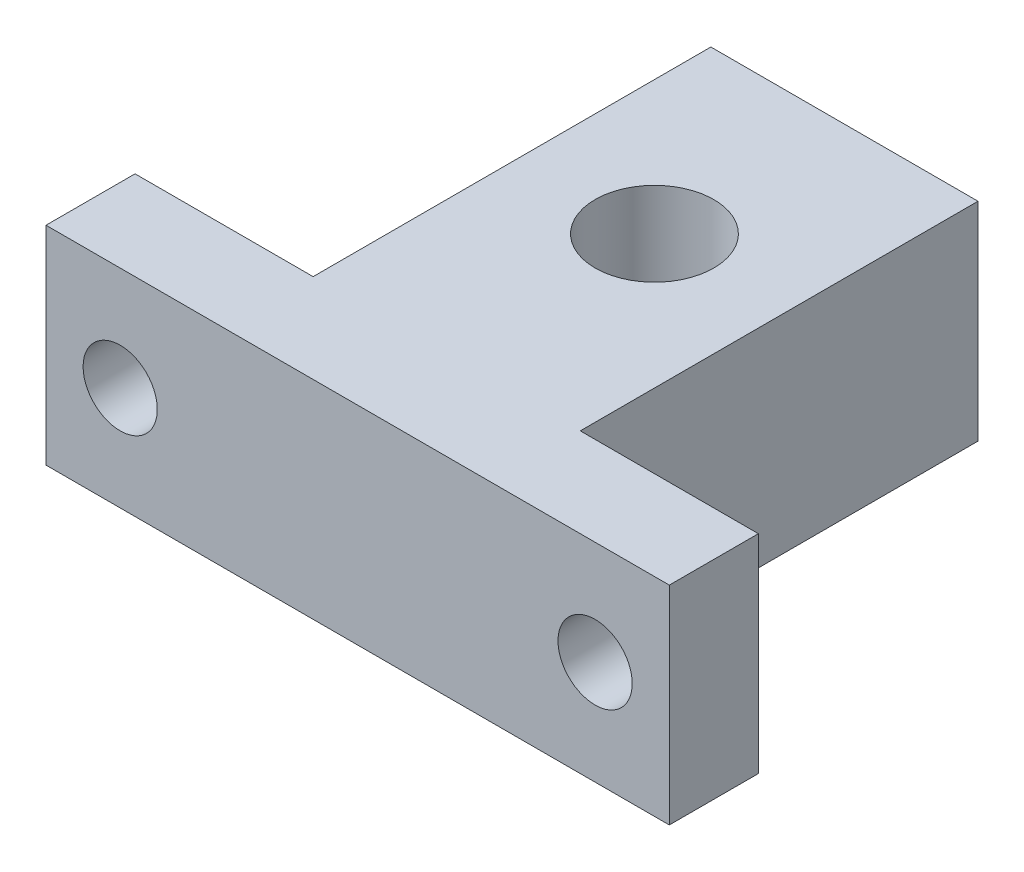
ISO-10303-21;
HEADER;
FILE_DESCRIPTION(('STEP AP214'),'2;1');
FILE_NAME('part.step','',(''),(''),'','','');
FILE_SCHEMA(('AUTOMOTIVE_DESIGN { 1 0 10303 214 1 1 1 1 }'));
ENDSEC;
DATA;
#1=APPLICATION_CONTEXT('core data for automotive mechanical design processes');
#2=APPLICATION_PROTOCOL_DEFINITION('international standard','automotive_design',2000,#1);
#3=PRODUCT_CONTEXT('',#1,'mechanical');
#4=PRODUCT('Part','Part','',(#3));
#5=PRODUCT_RELATED_PRODUCT_CATEGORY('part','',(#4));
#6=PRODUCT_DEFINITION_FORMATION('','',#4);
#7=PRODUCT_DEFINITION_CONTEXT('part definition',#1,'design');
#8=PRODUCT_DEFINITION('design','',#6,#7);
#9=PRODUCT_DEFINITION_SHAPE('','',#8);
#10=(LENGTH_UNIT() NAMED_UNIT(*) SI_UNIT(.MILLI.,.METRE.));
#11=(NAMED_UNIT(*) PLANE_ANGLE_UNIT() SI_UNIT($,.RADIAN.));
#12=(NAMED_UNIT(*) SI_UNIT($,.STERADIAN.) SOLID_ANGLE_UNIT());
#13=UNCERTAINTY_MEASURE_WITH_UNIT(LENGTH_MEASURE(1.E-05),#10,'distance_accuracy_value','');
#14=(GEOMETRIC_REPRESENTATION_CONTEXT(3) GLOBAL_UNCERTAINTY_ASSIGNED_CONTEXT((#13)) GLOBAL_UNIT_ASSIGNED_CONTEXT((#10,
#11,#12)) REPRESENTATION_CONTEXT('',''));
#15=CARTESIAN_POINT('',(0.,0.,0.));
#16=DIRECTION('',(0.,0.,1.));
#17=DIRECTION('',(1.,0.,0.));
#18=AXIS2_PLACEMENT_3D('',#15,#16,#17);
#19=CARTESIAN_POINT('',(9.,14.,0.));
#20=DIRECTION('',(1.,0.,0.));
#21=DIRECTION('',(0.,0.,-1.));
#22=AXIS2_PLACEMENT_3D('',#19,#20,#21);
#23=PLANE('',#22);
#24=DIRECTION('',(0.,0.,1.));
#25=VECTOR('',#24,1.);
#26=CARTESIAN_POINT('',(9.,0.,0.));
#27=LINE('',#26,#25);
#28=CARTESIAN_POINT('',(9.,0.,-12.8));
#29=VERTEX_POINT('',#28);
#30=CARTESIAN_POINT('',(9.,0.,14.));
#31=VERTEX_POINT('',#30);
#32=EDGE_CURVE('E136',#29,#31,#27,.T.);
#33=ORIENTED_EDGE('',*,*,#32,.F.);
#34=DIRECTION('',(0.,-1.,0.));
#35=VECTOR('',#34,1.);
#36=CARTESIAN_POINT('',(9.,14.,-12.8));
#37=LINE('',#36,#35);
#38=CARTESIAN_POINT('',(9.,14.,-12.8));
#39=VERTEX_POINT('',#38);
#40=EDGE_CURVE('E11',#39,#29,#37,.T.);
#41=ORIENTED_EDGE('',*,*,#40,.F.);
#42=DIRECTION('',(0.,0.,1.));
#43=VECTOR('',#42,1.);
#44=CARTESIAN_POINT('',(9.,14.,0.));
#45=LINE('',#44,#43);
#46=CARTESIAN_POINT('',(9.,14.,14.));
#47=VERTEX_POINT('',#46);
#48=EDGE_CURVE('E299',#39,#47,#45,.T.);
#49=ORIENTED_EDGE('',*,*,#48,.T.);
#50=DIRECTION('',(0.,-1.,0.));
#51=VECTOR('',#50,1.);
#52=CARTESIAN_POINT('',(9.,14.,14.));
#53=LINE('',#52,#51);
#54=EDGE_CURVE('E56',#47,#31,#53,.T.);
#55=ORIENTED_EDGE('',*,*,#54,.T.);
#56=EDGE_LOOP('',(#33,#41,#49,#55));
#57=FACE_BOUND('',#56,.T.);
#58=ADVANCED_FACE('F38',(#57),#23,.T.);
#59=CARTESIAN_POINT('',(0.,14.,-12.8));
#60=DIRECTION('',(0.,0.,-1.));
#61=DIRECTION('',(-1.,0.,0.));
#62=AXIS2_PLACEMENT_3D('',#59,#60,#61);
#63=PLANE('',#62);
#64=DIRECTION('',(1.,0.,0.));
#65=VECTOR('',#64,1.);
#66=CARTESIAN_POINT('',(0.,0.,-12.8));
#67=LINE('',#66,#65);
#68=CARTESIAN_POINT('',(-9.,0.,-12.8));
#69=VERTEX_POINT('',#68);
#70=EDGE_CURVE('E138',#69,#29,#67,.T.);
#71=ORIENTED_EDGE('',*,*,#70,.F.);
#72=DIRECTION('',(0.,-1.,0.));
#73=VECTOR('',#72,1.);
#74=CARTESIAN_POINT('',(-9.,14.,-12.8));
#75=LINE('',#74,#73);
#76=CARTESIAN_POINT('',(-9.,14.,-12.8));
#77=VERTEX_POINT('',#76);
#78=EDGE_CURVE('E48',#77,#69,#75,.T.);
#79=ORIENTED_EDGE('',*,*,#78,.F.);
#80=DIRECTION('',(1.,0.,0.));
#81=VECTOR('',#80,1.);
#82=CARTESIAN_POINT('',(0.,14.,-12.8));
#83=LINE('',#82,#81);
#84=EDGE_CURVE('E179',#77,#39,#83,.T.);
#85=ORIENTED_EDGE('',*,*,#84,.T.);
#86=ORIENTED_EDGE('',*,*,#40,.T.);
#87=EDGE_LOOP('',(#71,#79,#85,#86));
#88=FACE_BOUND('',#87,.T.);
#89=ADVANCED_FACE('F178',(#88),#63,.T.);
#90=CARTESIAN_POINT('',(-9.,14.,0.));
#91=DIRECTION('',(1.,0.,0.));
#92=DIRECTION('',(0.,0.,-1.));
#93=AXIS2_PLACEMENT_3D('',#90,#91,#92);
#94=PLANE('',#93);
#95=DIRECTION('',(0.,0.,1.));
#96=VECTOR('',#95,1.);
#97=CARTESIAN_POINT('',(-9.,0.,0.));
#98=LINE('',#97,#96);
#99=CARTESIAN_POINT('',(-9.,0.,14.));
#100=VERTEX_POINT('',#99);
#101=EDGE_CURVE('E141',#69,#100,#98,.T.);
#102=ORIENTED_EDGE('',*,*,#101,.T.);
#103=DIRECTION('',(0.,-1.,0.));
#104=VECTOR('',#103,1.);
#105=CARTESIAN_POINT('',(-9.,14.,14.));
#106=LINE('',#105,#104);
#107=CARTESIAN_POINT('',(-9.,14.,14.));
#108=VERTEX_POINT('',#107);
#109=EDGE_CURVE('E162',#108,#100,#106,.T.);
#110=ORIENTED_EDGE('',*,*,#109,.F.);
#111=DIRECTION('',(0.,0.,1.));
#112=VECTOR('',#111,1.);
#113=CARTESIAN_POINT('',(-9.,14.,0.));
#114=LINE('',#113,#112);
#115=EDGE_CURVE('E169',#77,#108,#114,.T.);
#116=ORIENTED_EDGE('',*,*,#115,.F.);
#117=ORIENTED_EDGE('',*,*,#78,.T.);
#118=EDGE_LOOP('',(#102,#110,#116,#117));
#119=FACE_BOUND('',#118,.T.);
#120=ADVANCED_FACE('F167',(#119),#94,.F.);
#121=CARTESIAN_POINT('',(0.,14.,14.));
#122=DIRECTION('',(0.,0.,-1.));
#123=DIRECTION('',(-1.,0.,0.));
#124=AXIS2_PLACEMENT_3D('',#121,#122,#123);
#125=PLANE('',#124);
#126=CARTESIAN_POINT('',(-16.,7.,14.));
#127=DIRECTION('',(0.,0.,-1.));
#128=DIRECTION('',(1.,0.,0.));
#129=AXIS2_PLACEMENT_3D('',#126,#127,#128);
#130=CIRCLE('',#129,2.5);
#131=CARTESIAN_POINT('',(-13.5,7.,14.));
#132=VERTEX_POINT('',#131);
#133=EDGE_CURVE('E284',#132,#132,#130,.T.);
#134=ORIENTED_EDGE('',*,*,#133,.F.);
#135=EDGE_LOOP('',(#134));
#136=FACE_BOUND('',#135,.T.);
#137=DIRECTION('',(1.,0.,0.));
#138=VECTOR('',#137,1.);
#139=CARTESIAN_POINT('',(0.,0.,14.));
#140=LINE('',#139,#138);
#141=CARTESIAN_POINT('',(-21.,0.,14.));
#142=VERTEX_POINT('',#141);
#143=EDGE_CURVE('E144',#142,#100,#140,.T.);
#144=ORIENTED_EDGE('',*,*,#143,.F.);
#145=DIRECTION('',(0.,-1.,0.));
#146=VECTOR('',#145,1.);
#147=CARTESIAN_POINT('',(-21.,14.,14.));
#148=LINE('',#147,#146);
#149=CARTESIAN_POINT('',(-21.,14.,14.));
#150=VERTEX_POINT('',#149);
#151=EDGE_CURVE('E160',#150,#142,#148,.T.);
#152=ORIENTED_EDGE('',*,*,#151,.F.);
#153=DIRECTION('',(1.,0.,0.));
#154=VECTOR('',#153,1.);
#155=CARTESIAN_POINT('',(0.,14.,14.));
#156=LINE('',#155,#154);
#157=EDGE_CURVE('E303',#150,#108,#156,.T.);
#158=ORIENTED_EDGE('',*,*,#157,.T.);
#159=ORIENTED_EDGE('',*,*,#109,.T.);
#160=EDGE_LOOP('',(#144,#152,#158,#159));
#161=FACE_BOUND('',#160,.T.);
#162=ADVANCED_FACE('F202',(#136,#161),#125,.T.);
#163=CARTESIAN_POINT('',(-21.,14.,0.));
#164=DIRECTION('',(1.,0.,0.));
#165=DIRECTION('',(0.,0.,-1.));
#166=AXIS2_PLACEMENT_3D('',#163,#164,#165);
#167=PLANE('',#166);
#168=DIRECTION('',(0.,0.,1.));
#169=VECTOR('',#168,1.);
#170=CARTESIAN_POINT('',(-21.,0.,0.));
#171=LINE('',#170,#169);
#172=CARTESIAN_POINT('',(-21.,0.,20.));
#173=VERTEX_POINT('',#172);
#174=EDGE_CURVE('E147',#142,#173,#171,.T.);
#175=ORIENTED_EDGE('',*,*,#174,.T.);
#176=DIRECTION('',(0.,-1.,0.));
#177=VECTOR('',#176,1.);
#178=CARTESIAN_POINT('',(-21.,14.,20.));
#179=LINE('',#178,#177);
#180=CARTESIAN_POINT('',(-21.,14.,20.));
#181=VERTEX_POINT('',#180);
#182=EDGE_CURVE('E125',#181,#173,#179,.T.);
#183=ORIENTED_EDGE('',*,*,#182,.F.);
#184=DIRECTION('',(0.,0.,1.));
#185=VECTOR('',#184,1.);
#186=CARTESIAN_POINT('',(-21.,14.,0.));
#187=LINE('',#186,#185);
#188=EDGE_CURVE('E114',#150,#181,#187,.T.);
#189=ORIENTED_EDGE('',*,*,#188,.F.);
#190=ORIENTED_EDGE('',*,*,#151,.T.);
#191=EDGE_LOOP('',(#175,#183,#189,#190));
#192=FACE_BOUND('',#191,.T.);
#193=ADVANCED_FACE('F205',(#192),#167,.F.);
#194=CARTESIAN_POINT('',(0.,14.,20.));
#195=DIRECTION('',(0.,0.,-1.));
#196=DIRECTION('',(-1.,0.,0.));
#197=AXIS2_PLACEMENT_3D('',#194,#195,#196);
#198=PLANE('',#197);
#199=CARTESIAN_POINT('',(16.,7.,20.));
#200=DIRECTION('',(0.,0.,-1.));
#201=DIRECTION('',(-1.,0.,0.));
#202=AXIS2_PLACEMENT_3D('',#199,#200,#201);
#203=CIRCLE('',#202,2.5);
#204=CARTESIAN_POINT('',(13.5,7.,20.));
#205=VERTEX_POINT('',#204);
#206=EDGE_CURVE('E288',#205,#205,#203,.T.);
#207=ORIENTED_EDGE('',*,*,#206,.T.);
#208=EDGE_LOOP('',(#207));
#209=FACE_BOUND('',#208,.T.);
#210=CARTESIAN_POINT('',(-16.,7.,20.));
#211=DIRECTION('',(0.,0.,-1.));
#212=DIRECTION('',(-1.,0.,0.));
#213=AXIS2_PLACEMENT_3D('',#210,#211,#212);
#214=CIRCLE('',#213,2.5);
#215=CARTESIAN_POINT('',(-18.5,7.,20.));
#216=VERTEX_POINT('',#215);
#217=EDGE_CURVE('E42',#216,#216,#214,.T.);
#218=ORIENTED_EDGE('',*,*,#217,.T.);
#219=EDGE_LOOP('',(#218));
#220=FACE_BOUND('',#219,.T.);
#221=DIRECTION('',(1.,0.,0.));
#222=VECTOR('',#221,1.);
#223=CARTESIAN_POINT('',(0.,0.,20.));
#224=LINE('',#223,#222);
#225=CARTESIAN_POINT('',(21.,0.,20.));
#226=VERTEX_POINT('',#225);
#227=EDGE_CURVE('E122',#173,#226,#224,.T.);
#228=ORIENTED_EDGE('',*,*,#227,.T.);
#229=DIRECTION('',(0.,-1.,0.));
#230=VECTOR('',#229,1.);
#231=CARTESIAN_POINT('',(21.,14.,20.));
#232=LINE('',#231,#230);
#233=CARTESIAN_POINT('',(21.,14.,20.));
#234=VERTEX_POINT('',#233);
#235=EDGE_CURVE('E120',#234,#226,#232,.T.);
#236=ORIENTED_EDGE('',*,*,#235,.F.);
#237=DIRECTION('',(1.,0.,0.));
#238=VECTOR('',#237,1.);
#239=CARTESIAN_POINT('',(0.,14.,20.));
#240=LINE('',#239,#238);
#241=EDGE_CURVE('E106',#181,#234,#240,.T.);
#242=ORIENTED_EDGE('',*,*,#241,.F.);
#243=ORIENTED_EDGE('',*,*,#182,.T.);
#244=EDGE_LOOP('',(#228,#236,#242,#243));
#245=FACE_BOUND('',#244,.T.);
#246=ADVANCED_FACE('F121',(#209,#220,#245),#198,.F.);
#247=CARTESIAN_POINT('',(21.,14.,0.));
#248=DIRECTION('',(1.,0.,0.));
#249=DIRECTION('',(0.,0.,-1.));
#250=AXIS2_PLACEMENT_3D('',#247,#248,#249);
#251=PLANE('',#250);
#252=DIRECTION('',(0.,0.,1.));
#253=VECTOR('',#252,1.);
#254=CARTESIAN_POINT('',(21.,0.,0.));
#255=LINE('',#254,#253);
#256=CARTESIAN_POINT('',(21.,0.,14.));
#257=VERTEX_POINT('',#256);
#258=EDGE_CURVE('E151',#257,#226,#255,.T.);
#259=ORIENTED_EDGE('',*,*,#258,.F.);
#260=DIRECTION('',(0.,-1.,0.));
#261=VECTOR('',#260,1.);
#262=CARTESIAN_POINT('',(21.,14.,14.));
#263=LINE('',#262,#261);
#264=CARTESIAN_POINT('',(21.,14.,14.));
#265=VERTEX_POINT('',#264);
#266=EDGE_CURVE('E81',#265,#257,#263,.T.);
#267=ORIENTED_EDGE('',*,*,#266,.F.);
#268=DIRECTION('',(0.,0.,1.));
#269=VECTOR('',#268,1.);
#270=CARTESIAN_POINT('',(21.,14.,0.));
#271=LINE('',#270,#269);
#272=EDGE_CURVE('E111',#265,#234,#271,.T.);
#273=ORIENTED_EDGE('',*,*,#272,.T.);
#274=ORIENTED_EDGE('',*,*,#235,.T.);
#275=EDGE_LOOP('',(#259,#267,#273,#274));
#276=FACE_BOUND('',#275,.T.);
#277=ADVANCED_FACE('F127',(#276),#251,.T.);
#278=CARTESIAN_POINT('',(0.,14.,0.));
#279=DIRECTION('',(0.,-1.,0.));
#280=DIRECTION('',(0.,0.,-1.));
#281=AXIS2_PLACEMENT_3D('',#278,#279,#280);
#282=CYLINDRICAL_SURFACE('',#281,4.);
#283=CARTESIAN_POINT('',(0.,14.,0.));
#284=DIRECTION('',(0.,1.,0.));
#285=DIRECTION('',(0.,0.,1.));
#286=AXIS2_PLACEMENT_3D('',#283,#284,#285);
#287=CIRCLE('',#286,4.);
#288=CARTESIAN_POINT('',(0.,14.,4.));
#289=VERTEX_POINT('',#288);
#290=EDGE_CURVE('E156',#289,#289,#287,.T.);
#291=ORIENTED_EDGE('',*,*,#290,.T.);
#292=EDGE_LOOP('',(#291));
#293=FACE_BOUND('',#292,.T.);
#294=CARTESIAN_POINT('',(0.,0.,0.));
#295=DIRECTION('',(0.,1.,0.));
#296=DIRECTION('',(0.,0.,1.));
#297=AXIS2_PLACEMENT_3D('',#294,#295,#296);
#298=CIRCLE('',#297,4.);
#299=CARTESIAN_POINT('',(0.,0.,4.));
#300=VERTEX_POINT('',#299);
#301=EDGE_CURVE('E133',#300,#300,#298,.T.);
#302=ORIENTED_EDGE('',*,*,#301,.F.);
#303=EDGE_LOOP('',(#302));
#304=FACE_BOUND('',#303,.T.);
#305=ADVANCED_FACE('F40',(#293,#304),#282,.F.);
#306=CARTESIAN_POINT('',(0.,14.,14.));
#307=DIRECTION('',(0.,0.,-1.));
#308=DIRECTION('',(-1.,0.,0.));
#309=AXIS2_PLACEMENT_3D('',#306,#307,#308);
#310=PLANE('',#309);
#311=CARTESIAN_POINT('',(16.,7.,14.));
#312=DIRECTION('',(0.,0.,-1.));
#313=DIRECTION('',(-1.,0.,0.));
#314=AXIS2_PLACEMENT_3D('',#311,#312,#313);
#315=CIRCLE('',#314,2.5);
#316=CARTESIAN_POINT('',(13.5,7.,14.));
#317=VERTEX_POINT('',#316);
#318=EDGE_CURVE('E290',#317,#317,#315,.T.);
#319=ORIENTED_EDGE('',*,*,#318,.F.);
#320=EDGE_LOOP('',(#319));
#321=FACE_BOUND('',#320,.T.);
#322=DIRECTION('',(1.,0.,0.));
#323=VECTOR('',#322,1.);
#324=CARTESIAN_POINT('',(0.,0.,14.));
#325=LINE('',#324,#323);
#326=EDGE_CURVE('E153',#31,#257,#325,.T.);
#327=ORIENTED_EDGE('',*,*,#326,.F.);
#328=ORIENTED_EDGE('',*,*,#54,.F.);
#329=DIRECTION('',(1.,0.,0.));
#330=VECTOR('',#329,1.);
#331=CARTESIAN_POINT('',(0.,14.,14.));
#332=LINE('',#331,#330);
#333=EDGE_CURVE('E128',#47,#265,#332,.T.);
#334=ORIENTED_EDGE('',*,*,#333,.T.);
#335=ORIENTED_EDGE('',*,*,#266,.T.);
#336=EDGE_LOOP('',(#327,#328,#334,#335));
#337=FACE_BOUND('',#336,.T.);
#338=ADVANCED_FACE('F180',(#321,#337),#310,.T.);
#339=CARTESIAN_POINT('',(0.,14.,0.));
#340=DIRECTION('',(0.,1.,0.));
#341=DIRECTION('',(0.,0.,1.));
#342=AXIS2_PLACEMENT_3D('',#339,#340,#341);
#343=PLANE('',#342);
#344=ORIENTED_EDGE('',*,*,#290,.F.);
#345=EDGE_LOOP('',(#344));
#346=FACE_BOUND('',#345,.T.);
#347=ORIENTED_EDGE('',*,*,#48,.F.);
#348=ORIENTED_EDGE('',*,*,#84,.F.);
#349=ORIENTED_EDGE('',*,*,#115,.T.);
#350=ORIENTED_EDGE('',*,*,#157,.F.);
#351=ORIENTED_EDGE('',*,*,#188,.T.);
#352=ORIENTED_EDGE('',*,*,#241,.T.);
#353=ORIENTED_EDGE('',*,*,#272,.F.);
#354=ORIENTED_EDGE('',*,*,#333,.F.);
#355=EDGE_LOOP('',(#347,#348,#349,#350,#351,#352,#353,#354));
#356=FACE_BOUND('',#355,.T.);
#357=ADVANCED_FACE('F108',(#346,#356),#343,.T.);
#358=CARTESIAN_POINT('',(0.,0.,0.));
#359=DIRECTION('',(0.,1.,0.));
#360=DIRECTION('',(0.,0.,1.));
#361=AXIS2_PLACEMENT_3D('',#358,#359,#360);
#362=PLANE('',#361);
#363=ORIENTED_EDGE('',*,*,#301,.T.);
#364=EDGE_LOOP('',(#363));
#365=FACE_BOUND('',#364,.T.);
#366=ORIENTED_EDGE('',*,*,#32,.T.);
#367=ORIENTED_EDGE('',*,*,#326,.T.);
#368=ORIENTED_EDGE('',*,*,#258,.T.);
#369=ORIENTED_EDGE('',*,*,#227,.F.);
#370=ORIENTED_EDGE('',*,*,#174,.F.);
#371=ORIENTED_EDGE('',*,*,#143,.T.);
#372=ORIENTED_EDGE('',*,*,#101,.F.);
#373=ORIENTED_EDGE('',*,*,#70,.T.);
#374=EDGE_LOOP('',(#366,#367,#368,#369,#370,#371,#372,#373));
#375=FACE_BOUND('',#374,.T.);
#376=ADVANCED_FACE('F175',(#365,#375),#362,.F.);
#377=CARTESIAN_POINT('',(16.,7.,28.));
#378=DIRECTION('',(0.,0.,-1.));
#379=DIRECTION('',(-1.,0.,0.));
#380=AXIS2_PLACEMENT_3D('',#377,#378,#379);
#381=CYLINDRICAL_SURFACE('',#380,2.5);
#382=ORIENTED_EDGE('',*,*,#318,.T.);
#383=EDGE_LOOP('',(#382));
#384=FACE_BOUND('',#383,.T.);
#385=ORIENTED_EDGE('',*,*,#206,.F.);
#386=EDGE_LOOP('',(#385));
#387=FACE_BOUND('',#386,.T.);
#388=ADVANCED_FACE('F240',(#384,#387),#381,.F.);
#389=CARTESIAN_POINT('',(-16.,7.,28.));
#390=DIRECTION('',(0.,0.,-1.));
#391=DIRECTION('',(-1.,0.,0.));
#392=AXIS2_PLACEMENT_3D('',#389,#390,#391);
#393=CYLINDRICAL_SURFACE('',#392,2.5);
#394=ORIENTED_EDGE('',*,*,#133,.T.);
#395=EDGE_LOOP('',(#394));
#396=FACE_BOUND('',#395,.T.);
#397=ORIENTED_EDGE('',*,*,#217,.F.);
#398=EDGE_LOOP('',(#397));
#399=FACE_BOUND('',#398,.T.);
#400=ADVANCED_FACE('F267',(#396,#399),#393,.F.);
#401=CLOSED_SHELL('',(#58,#89,#120,#162,#193,#246,#277,#305,#338,#357,#376,#388,#400));
#402=MANIFOLD_SOLID_BREP('B2',#401);
#403=ADVANCED_BREP_SHAPE_REPRESENTATION('',(#18,#402),#14);
#404=SHAPE_DEFINITION_REPRESENTATION(#9,#403);
ENDSEC;
END-ISO-10303-21;
